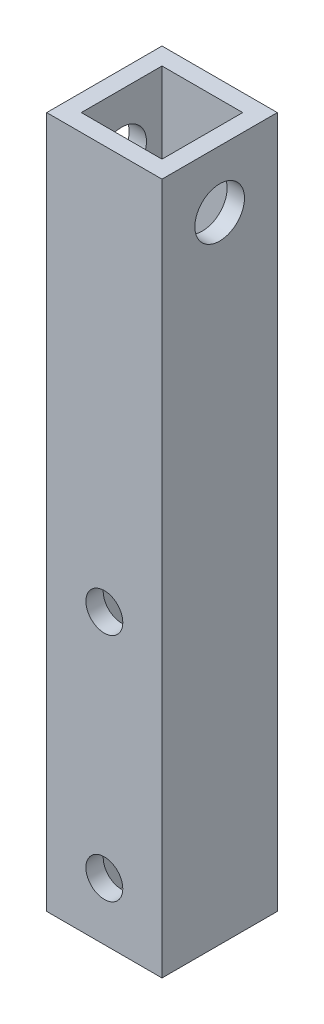
ISO-10303-21;
HEADER;
FILE_DESCRIPTION(('STEP AP214'),'2;1');
FILE_NAME('part.step','',(''),(''),'','','');
FILE_SCHEMA(('AUTOMOTIVE_DESIGN { 1 0 10303 214 1 1 1 1 }'));
ENDSEC;
DATA;
#1=APPLICATION_CONTEXT('core data for automotive mechanical design processes');
#2=APPLICATION_PROTOCOL_DEFINITION('international standard','automotive_design',2000,#1);
#3=PRODUCT_CONTEXT('',#1,'mechanical');
#4=PRODUCT('Part','Part','',(#3));
#5=PRODUCT_RELATED_PRODUCT_CATEGORY('part','',(#4));
#6=PRODUCT_DEFINITION_FORMATION('','',#4);
#7=PRODUCT_DEFINITION_CONTEXT('part definition',#1,'design');
#8=PRODUCT_DEFINITION('design','',#6,#7);
#9=PRODUCT_DEFINITION_SHAPE('','',#8);
#10=(LENGTH_UNIT() NAMED_UNIT(*) SI_UNIT(.MILLI.,.METRE.));
#11=(NAMED_UNIT(*) PLANE_ANGLE_UNIT() SI_UNIT($,.RADIAN.));
#12=(NAMED_UNIT(*) SI_UNIT($,.STERADIAN.) SOLID_ANGLE_UNIT());
#13=UNCERTAINTY_MEASURE_WITH_UNIT(LENGTH_MEASURE(1.E-05),#10,'distance_accuracy_value','');
#14=(GEOMETRIC_REPRESENTATION_CONTEXT(3) GLOBAL_UNCERTAINTY_ASSIGNED_CONTEXT((#13)) GLOBAL_UNIT_ASSIGNED_CONTEXT((#10,
#11,#12)) REPRESENTATION_CONTEXT('',''));
#15=CARTESIAN_POINT('',(0.,0.,0.));
#16=DIRECTION('',(0.,0.,1.));
#17=DIRECTION('',(1.,0.,0.));
#18=AXIS2_PLACEMENT_3D('',#15,#16,#17);
#19=CARTESIAN_POINT('',(0.,60.,0.));
#20=DIRECTION('',(0.,1.,0.));
#21=DIRECTION('',(0.,0.,1.));
#22=AXIS2_PLACEMENT_3D('',#19,#20,#21);
#23=PLANE('',#22);
#24=DIRECTION('',(0.,0.,-1.));
#25=VECTOR('',#24,1.);
#26=CARTESIAN_POINT('',(5.,60.,-5.));
#27=LINE('',#26,#25);
#28=CARTESIAN_POINT('',(5.,60.,5.));
#29=VERTEX_POINT('',#28);
#30=CARTESIAN_POINT('',(5.,60.,-5.));
#31=VERTEX_POINT('',#30);
#32=EDGE_CURVE('E162',#29,#31,#27,.T.);
#33=ORIENTED_EDGE('',*,*,#32,.T.);
#34=DIRECTION('',(-1.,0.,0.));
#35=VECTOR('',#34,1.);
#36=CARTESIAN_POINT('',(-5.,60.,-5.));
#37=LINE('',#36,#35);
#38=CARTESIAN_POINT('',(-5.,60.,-5.));
#39=VERTEX_POINT('',#38);
#40=EDGE_CURVE('E165',#31,#39,#37,.T.);
#41=ORIENTED_EDGE('',*,*,#40,.T.);
#42=DIRECTION('',(0.,0.,1.));
#43=VECTOR('',#42,1.);
#44=CARTESIAN_POINT('',(-5.,60.,-5.));
#45=LINE('',#44,#43);
#46=CARTESIAN_POINT('',(-5.,60.,5.));
#47=VERTEX_POINT('',#46);
#48=EDGE_CURVE('E168',#39,#47,#45,.T.);
#49=ORIENTED_EDGE('',*,*,#48,.T.);
#50=DIRECTION('',(1.,0.,0.));
#51=VECTOR('',#50,1.);
#52=CARTESIAN_POINT('',(-5.,60.,5.));
#53=LINE('',#52,#51);
#54=EDGE_CURVE('E170',#47,#29,#53,.T.);
#55=ORIENTED_EDGE('',*,*,#54,.T.);
#56=EDGE_LOOP('',(#33,#41,#49,#55));
#57=FACE_BOUND('',#56,.T.);
#58=DIRECTION('',(-1.,0.,0.));
#59=VECTOR('',#58,1.);
#60=CARTESIAN_POINT('',(-5.,60.,-3.5));
#61=LINE('',#60,#59);
#62=CARTESIAN_POINT('',(3.5,60.,-3.5));
#63=VERTEX_POINT('',#62);
#64=CARTESIAN_POINT('',(-3.5,60.,-3.5));
#65=VERTEX_POINT('',#64);
#66=EDGE_CURVE('E132',#63,#65,#61,.T.);
#67=ORIENTED_EDGE('',*,*,#66,.F.);
#68=DIRECTION('',(0.,0.,-1.));
#69=VECTOR('',#68,1.);
#70=CARTESIAN_POINT('',(3.5,60.,-5.));
#71=LINE('',#70,#69);
#72=CARTESIAN_POINT('',(3.5,60.,3.5));
#73=VERTEX_POINT('',#72);
#74=EDGE_CURVE('E124',#73,#63,#71,.T.);
#75=ORIENTED_EDGE('',*,*,#74,.F.);
#76=DIRECTION('',(1.,0.,0.));
#77=VECTOR('',#76,1.);
#78=CARTESIAN_POINT('',(-5.,60.,3.5));
#79=LINE('',#78,#77);
#80=CARTESIAN_POINT('',(-3.5,60.,3.5));
#81=VERTEX_POINT('',#80);
#82=EDGE_CURVE('E146',#81,#73,#79,.T.);
#83=ORIENTED_EDGE('',*,*,#82,.F.);
#84=DIRECTION('',(0.,0.,1.));
#85=VECTOR('',#84,1.);
#86=CARTESIAN_POINT('',(-3.5,60.,-5.));
#87=LINE('',#86,#85);
#88=EDGE_CURVE('E144',#65,#81,#87,.T.);
#89=ORIENTED_EDGE('',*,*,#88,.F.);
#90=EDGE_LOOP('',(#67,#75,#83,#89));
#91=FACE_BOUND('',#90,.T.);
#92=ADVANCED_FACE('F57',(#57,#91),#23,.T.);
#93=CARTESIAN_POINT('',(0.,0.,0.));
#94=DIRECTION('',(0.,1.,0.));
#95=DIRECTION('',(0.,0.,1.));
#96=AXIS2_PLACEMENT_3D('',#93,#94,#95);
#97=PLANE('',#96);
#98=DIRECTION('',(0.,0.,-1.));
#99=VECTOR('',#98,1.);
#100=CARTESIAN_POINT('',(5.,0.,-5.));
#101=LINE('',#100,#99);
#102=CARTESIAN_POINT('',(5.,0.,5.));
#103=VERTEX_POINT('',#102);
#104=CARTESIAN_POINT('',(5.,0.,-5.));
#105=VERTEX_POINT('',#104);
#106=EDGE_CURVE('E140',#103,#105,#101,.T.);
#107=ORIENTED_EDGE('',*,*,#106,.F.);
#108=DIRECTION('',(1.,0.,0.));
#109=VECTOR('',#108,1.);
#110=CARTESIAN_POINT('',(-5.,0.,5.));
#111=LINE('',#110,#109);
#112=CARTESIAN_POINT('',(-5.,0.,5.));
#113=VERTEX_POINT('',#112);
#114=EDGE_CURVE('E166',#113,#103,#111,.T.);
#115=ORIENTED_EDGE('',*,*,#114,.F.);
#116=DIRECTION('',(0.,0.,1.));
#117=VECTOR('',#116,1.);
#118=CARTESIAN_POINT('',(-5.,0.,-5.));
#119=LINE('',#118,#117);
#120=CARTESIAN_POINT('',(-5.,0.,-5.));
#121=VERTEX_POINT('',#120);
#122=EDGE_CURVE('E177',#121,#113,#119,.T.);
#123=ORIENTED_EDGE('',*,*,#122,.F.);
#124=DIRECTION('',(-1.,0.,0.));
#125=VECTOR('',#124,1.);
#126=CARTESIAN_POINT('',(-5.,0.,-5.));
#127=LINE('',#126,#125);
#128=EDGE_CURVE('E175',#105,#121,#127,.T.);
#129=ORIENTED_EDGE('',*,*,#128,.F.);
#130=EDGE_LOOP('',(#107,#115,#123,#129));
#131=FACE_BOUND('',#130,.T.);
#132=DIRECTION('',(0.,0.,-1.));
#133=VECTOR('',#132,1.);
#134=CARTESIAN_POINT('',(3.5,0.,-5.));
#135=LINE('',#134,#133);
#136=CARTESIAN_POINT('',(3.5,0.,3.5));
#137=VERTEX_POINT('',#136);
#138=CARTESIAN_POINT('',(3.5,0.,-3.5));
#139=VERTEX_POINT('',#138);
#140=EDGE_CURVE('E82',#137,#139,#135,.T.);
#141=ORIENTED_EDGE('',*,*,#140,.T.);
#142=DIRECTION('',(-1.,0.,0.));
#143=VECTOR('',#142,1.);
#144=CARTESIAN_POINT('',(-5.,0.,-3.5));
#145=LINE('',#144,#143);
#146=CARTESIAN_POINT('',(-3.5,0.,-3.5));
#147=VERTEX_POINT('',#146);
#148=EDGE_CURVE('E139',#139,#147,#145,.T.);
#149=ORIENTED_EDGE('',*,*,#148,.T.);
#150=DIRECTION('',(0.,0.,1.));
#151=VECTOR('',#150,1.);
#152=CARTESIAN_POINT('',(-3.5,0.,-5.));
#153=LINE('',#152,#151);
#154=CARTESIAN_POINT('',(-3.5,0.,3.5));
#155=VERTEX_POINT('',#154);
#156=EDGE_CURVE('E154',#147,#155,#153,.T.);
#157=ORIENTED_EDGE('',*,*,#156,.T.);
#158=DIRECTION('',(1.,0.,0.));
#159=VECTOR('',#158,1.);
#160=CARTESIAN_POINT('',(-5.,0.,3.5));
#161=LINE('',#160,#159);
#162=EDGE_CURVE('E133',#155,#137,#161,.T.);
#163=ORIENTED_EDGE('',*,*,#162,.T.);
#164=EDGE_LOOP('',(#141,#149,#157,#163));
#165=FACE_BOUND('',#164,.T.);
#166=ADVANCED_FACE('F235',(#131,#165),#97,.F.);
#167=CARTESIAN_POINT('',(5.,60.,-5.));
#168=DIRECTION('',(-1.,0.,0.));
#169=DIRECTION('',(0.,0.,1.));
#170=AXIS2_PLACEMENT_3D('',#167,#168,#169);
#171=PLANE('',#170);
#172=CARTESIAN_POINT('',(5.,55.,0.));
#173=DIRECTION('',(1.,0.,0.));
#174=DIRECTION('',(0.,0.,-1.));
#175=AXIS2_PLACEMENT_3D('',#172,#173,#174);
#176=CIRCLE('',#175,2.15);
#177=CARTESIAN_POINT('',(5.,55.,-2.15));
#178=VERTEX_POINT('',#177);
#179=EDGE_CURVE('E215',#178,#178,#176,.T.);
#180=ORIENTED_EDGE('',*,*,#179,.F.);
#181=EDGE_LOOP('',(#180));
#182=FACE_BOUND('',#181,.T.);
#183=ORIENTED_EDGE('',*,*,#106,.T.);
#184=DIRECTION('',(0.,-1.,0.));
#185=VECTOR('',#184,1.);
#186=CARTESIAN_POINT('',(5.,60.,-5.));
#187=LINE('',#186,#185);
#188=EDGE_CURVE('E12',#31,#105,#187,.T.);
#189=ORIENTED_EDGE('',*,*,#188,.F.);
#190=ORIENTED_EDGE('',*,*,#32,.F.);
#191=DIRECTION('',(0.,-1.,0.));
#192=VECTOR('',#191,1.);
#193=CARTESIAN_POINT('',(5.,60.,5.));
#194=LINE('',#193,#192);
#195=EDGE_CURVE('E172',#29,#103,#194,.T.);
#196=ORIENTED_EDGE('',*,*,#195,.T.);
#197=EDGE_LOOP('',(#183,#189,#190,#196));
#198=FACE_BOUND('',#197,.T.);
#199=ADVANCED_FACE('F59',(#182,#198),#171,.F.);
#200=CARTESIAN_POINT('',(-5.,60.,-5.));
#201=DIRECTION('',(0.,0.,1.));
#202=DIRECTION('',(1.,0.,0.));
#203=AXIS2_PLACEMENT_3D('',#200,#201,#202);
#204=PLANE('',#203);
#205=CARTESIAN_POINT('',(0.,25.,-5.));
#206=DIRECTION('',(0.,0.,1.));
#207=DIRECTION('',(1.,0.,0.));
#208=AXIS2_PLACEMENT_3D('',#205,#206,#207);
#209=CIRCLE('',#208,1.6);
#210=CARTESIAN_POINT('',(1.6,25.,-5.));
#211=VERTEX_POINT('',#210);
#212=EDGE_CURVE('E190',#211,#211,#209,.T.);
#213=ORIENTED_EDGE('',*,*,#212,.T.);
#214=EDGE_LOOP('',(#213));
#215=FACE_BOUND('',#214,.T.);
#216=CARTESIAN_POINT('',(0.,5.,-5.));
#217=DIRECTION('',(0.,0.,1.));
#218=DIRECTION('',(1.,0.,0.));
#219=AXIS2_PLACEMENT_3D('',#216,#217,#218);
#220=CIRCLE('',#219,1.6);
#221=CARTESIAN_POINT('',(1.6,5.,-5.));
#222=VERTEX_POINT('',#221);
#223=EDGE_CURVE('E204',#222,#222,#220,.T.);
#224=ORIENTED_EDGE('',*,*,#223,.T.);
#225=EDGE_LOOP('',(#224));
#226=FACE_BOUND('',#225,.T.);
#227=ORIENTED_EDGE('',*,*,#128,.T.);
#228=DIRECTION('',(0.,-1.,0.));
#229=VECTOR('',#228,1.);
#230=CARTESIAN_POINT('',(-5.,60.,-5.));
#231=LINE('',#230,#229);
#232=EDGE_CURVE('E66',#39,#121,#231,.T.);
#233=ORIENTED_EDGE('',*,*,#232,.F.);
#234=ORIENTED_EDGE('',*,*,#40,.F.);
#235=ORIENTED_EDGE('',*,*,#188,.T.);
#236=EDGE_LOOP('',(#227,#233,#234,#235));
#237=FACE_BOUND('',#236,.T.);
#238=ADVANCED_FACE('F265',(#215,#226,#237),#204,.F.);
#239=CARTESIAN_POINT('',(-5.,60.,-5.));
#240=DIRECTION('',(1.,0.,0.));
#241=DIRECTION('',(0.,0.,-1.));
#242=AXIS2_PLACEMENT_3D('',#239,#240,#241);
#243=PLANE('',#242);
#244=CARTESIAN_POINT('',(-5.,55.,0.));
#245=DIRECTION('',(1.,0.,0.));
#246=DIRECTION('',(0.,0.,-1.));
#247=AXIS2_PLACEMENT_3D('',#244,#245,#246);
#248=CIRCLE('',#247,2.15);
#249=CARTESIAN_POINT('',(-5.,55.,-2.15));
#250=VERTEX_POINT('',#249);
#251=EDGE_CURVE('E218',#250,#250,#248,.T.);
#252=ORIENTED_EDGE('',*,*,#251,.T.);
#253=EDGE_LOOP('',(#252));
#254=FACE_BOUND('',#253,.T.);
#255=ORIENTED_EDGE('',*,*,#122,.T.);
#256=DIRECTION('',(0.,-1.,0.));
#257=VECTOR('',#256,1.);
#258=CARTESIAN_POINT('',(-5.,60.,5.));
#259=LINE('',#258,#257);
#260=EDGE_CURVE('E182',#47,#113,#259,.T.);
#261=ORIENTED_EDGE('',*,*,#260,.F.);
#262=ORIENTED_EDGE('',*,*,#48,.F.);
#263=ORIENTED_EDGE('',*,*,#232,.T.);
#264=EDGE_LOOP('',(#255,#261,#262,#263));
#265=FACE_BOUND('',#264,.T.);
#266=ADVANCED_FACE('F262',(#254,#265),#243,.F.);
#267=CARTESIAN_POINT('',(-5.,60.,5.));
#268=DIRECTION('',(0.,0.,-1.));
#269=DIRECTION('',(-1.,0.,0.));
#270=AXIS2_PLACEMENT_3D('',#267,#268,#269);
#271=PLANE('',#270);
#272=CARTESIAN_POINT('',(0.,25.,5.));
#273=DIRECTION('',(0.,0.,1.));
#274=DIRECTION('',(1.,0.,0.));
#275=AXIS2_PLACEMENT_3D('',#272,#273,#274);
#276=CIRCLE('',#275,1.6);
#277=CARTESIAN_POINT('',(1.6,25.,5.));
#278=VERTEX_POINT('',#277);
#279=EDGE_CURVE('E208',#278,#278,#276,.T.);
#280=ORIENTED_EDGE('',*,*,#279,.F.);
#281=EDGE_LOOP('',(#280));
#282=FACE_BOUND('',#281,.T.);
#283=CARTESIAN_POINT('',(0.,5.,5.));
#284=DIRECTION('',(0.,0.,1.));
#285=DIRECTION('',(1.,0.,0.));
#286=AXIS2_PLACEMENT_3D('',#283,#284,#285);
#287=CIRCLE('',#286,1.6);
#288=CARTESIAN_POINT('',(1.6,5.,5.));
#289=VERTEX_POINT('',#288);
#290=EDGE_CURVE('E201',#289,#289,#287,.T.);
#291=ORIENTED_EDGE('',*,*,#290,.F.);
#292=EDGE_LOOP('',(#291));
#293=FACE_BOUND('',#292,.T.);
#294=ORIENTED_EDGE('',*,*,#114,.T.);
#295=ORIENTED_EDGE('',*,*,#195,.F.);
#296=ORIENTED_EDGE('',*,*,#54,.F.);
#297=ORIENTED_EDGE('',*,*,#260,.T.);
#298=EDGE_LOOP('',(#294,#295,#296,#297));
#299=FACE_BOUND('',#298,.T.);
#300=ADVANCED_FACE('F259',(#282,#293,#299),#271,.F.);
#301=CARTESIAN_POINT('',(3.5,60.,-5.));
#302=DIRECTION('',(-1.,0.,0.));
#303=DIRECTION('',(0.,0.,1.));
#304=AXIS2_PLACEMENT_3D('',#301,#302,#303);
#305=PLANE('',#304);
#306=CARTESIAN_POINT('',(3.5,55.,0.));
#307=DIRECTION('',(-1.,0.,0.));
#308=DIRECTION('',(0.,0.,1.));
#309=AXIS2_PLACEMENT_3D('',#306,#307,#308);
#310=CIRCLE('',#309,2.15);
#311=CARTESIAN_POINT('',(3.5,55.,2.15));
#312=VERTEX_POINT('',#311);
#313=EDGE_CURVE('E205',#312,#312,#310,.T.);
#314=ORIENTED_EDGE('',*,*,#313,.F.);
#315=EDGE_LOOP('',(#314));
#316=FACE_BOUND('',#315,.T.);
#317=ORIENTED_EDGE('',*,*,#140,.F.);
#318=DIRECTION('',(0.,-1.,0.));
#319=VECTOR('',#318,1.);
#320=CARTESIAN_POINT('',(3.5,60.,3.5));
#321=LINE('',#320,#319);
#322=EDGE_CURVE('E128',#73,#137,#321,.T.);
#323=ORIENTED_EDGE('',*,*,#322,.F.);
#324=ORIENTED_EDGE('',*,*,#74,.T.);
#325=DIRECTION('',(0.,-1.,0.));
#326=VECTOR('',#325,1.);
#327=CARTESIAN_POINT('',(3.5,60.,-3.5));
#328=LINE('',#327,#326);
#329=EDGE_CURVE('E127',#63,#139,#328,.T.);
#330=ORIENTED_EDGE('',*,*,#329,.T.);
#331=EDGE_LOOP('',(#317,#323,#324,#330));
#332=FACE_BOUND('',#331,.T.);
#333=ADVANCED_FACE('F126',(#316,#332),#305,.T.);
#334=CARTESIAN_POINT('',(-5.,60.,-3.5));
#335=DIRECTION('',(0.,0.,1.));
#336=DIRECTION('',(1.,0.,0.));
#337=AXIS2_PLACEMENT_3D('',#334,#335,#336);
#338=PLANE('',#337);
#339=CARTESIAN_POINT('',(0.,25.,-3.5));
#340=DIRECTION('',(0.,0.,1.));
#341=DIRECTION('',(1.,0.,0.));
#342=AXIS2_PLACEMENT_3D('',#339,#340,#341);
#343=CIRCLE('',#342,1.6);
#344=CARTESIAN_POINT('',(1.6,25.,-3.5));
#345=VERTEX_POINT('',#344);
#346=EDGE_CURVE('E152',#345,#345,#343,.T.);
#347=ORIENTED_EDGE('',*,*,#346,.F.);
#348=EDGE_LOOP('',(#347));
#349=FACE_BOUND('',#348,.T.);
#350=CARTESIAN_POINT('',(0.,5.,-3.5));
#351=DIRECTION('',(0.,0.,1.));
#352=DIRECTION('',(1.,0.,0.));
#353=AXIS2_PLACEMENT_3D('',#350,#351,#352);
#354=CIRCLE('',#353,1.6);
#355=CARTESIAN_POINT('',(1.6,5.,-3.5));
#356=VERTEX_POINT('',#355);
#357=EDGE_CURVE('E189',#356,#356,#354,.T.);
#358=ORIENTED_EDGE('',*,*,#357,.F.);
#359=EDGE_LOOP('',(#358));
#360=FACE_BOUND('',#359,.T.);
#361=ORIENTED_EDGE('',*,*,#148,.F.);
#362=ORIENTED_EDGE('',*,*,#329,.F.);
#363=ORIENTED_EDGE('',*,*,#66,.T.);
#364=DIRECTION('',(0.,-1.,0.));
#365=VECTOR('',#364,1.);
#366=CARTESIAN_POINT('',(-3.5,60.,-3.5));
#367=LINE('',#366,#365);
#368=EDGE_CURVE('E141',#65,#147,#367,.T.);
#369=ORIENTED_EDGE('',*,*,#368,.T.);
#370=EDGE_LOOP('',(#361,#362,#363,#369));
#371=FACE_BOUND('',#370,.T.);
#372=ADVANCED_FACE('F136',(#349,#360,#371),#338,.T.);
#373=CARTESIAN_POINT('',(-3.5,60.,-5.));
#374=DIRECTION('',(1.,0.,0.));
#375=DIRECTION('',(0.,0.,-1.));
#376=AXIS2_PLACEMENT_3D('',#373,#374,#375);
#377=PLANE('',#376);
#378=CARTESIAN_POINT('',(-3.5,55.,0.));
#379=DIRECTION('',(1.,0.,0.));
#380=DIRECTION('',(0.,0.,-1.));
#381=AXIS2_PLACEMENT_3D('',#378,#379,#380);
#382=CIRCLE('',#381,2.15);
#383=CARTESIAN_POINT('',(-3.5,55.,-2.15));
#384=VERTEX_POINT('',#383);
#385=EDGE_CURVE('E61',#384,#384,#382,.T.);
#386=ORIENTED_EDGE('',*,*,#385,.F.);
#387=EDGE_LOOP('',(#386));
#388=FACE_BOUND('',#387,.T.);
#389=ORIENTED_EDGE('',*,*,#156,.F.);
#390=ORIENTED_EDGE('',*,*,#368,.F.);
#391=ORIENTED_EDGE('',*,*,#88,.T.);
#392=DIRECTION('',(0.,-1.,0.));
#393=VECTOR('',#392,1.);
#394=CARTESIAN_POINT('',(-3.5,60.,3.5));
#395=LINE('',#394,#393);
#396=EDGE_CURVE('E74',#81,#155,#395,.T.);
#397=ORIENTED_EDGE('',*,*,#396,.T.);
#398=EDGE_LOOP('',(#389,#390,#391,#397));
#399=FACE_BOUND('',#398,.T.);
#400=ADVANCED_FACE('F228',(#388,#399),#377,.T.);
#401=CARTESIAN_POINT('',(-5.,60.,3.5));
#402=DIRECTION('',(0.,0.,-1.));
#403=DIRECTION('',(-1.,0.,0.));
#404=AXIS2_PLACEMENT_3D('',#401,#402,#403);
#405=PLANE('',#404);
#406=CARTESIAN_POINT('',(0.,25.,3.5));
#407=DIRECTION('',(0.,0.,-1.));
#408=DIRECTION('',(-1.,0.,0.));
#409=AXIS2_PLACEMENT_3D('',#406,#407,#408);
#410=CIRCLE('',#409,1.6);
#411=CARTESIAN_POINT('',(-1.6,25.,3.5));
#412=VERTEX_POINT('',#411);
#413=EDGE_CURVE('E191',#412,#412,#410,.T.);
#414=ORIENTED_EDGE('',*,*,#413,.F.);
#415=EDGE_LOOP('',(#414));
#416=FACE_BOUND('',#415,.T.);
#417=CARTESIAN_POINT('',(0.,5.,3.5));
#418=DIRECTION('',(0.,0.,-1.));
#419=DIRECTION('',(-1.,0.,0.));
#420=AXIS2_PLACEMENT_3D('',#417,#418,#419);
#421=CIRCLE('',#420,1.6);
#422=CARTESIAN_POINT('',(-1.6,5.,3.5));
#423=VERTEX_POINT('',#422);
#424=EDGE_CURVE('E187',#423,#423,#421,.T.);
#425=ORIENTED_EDGE('',*,*,#424,.F.);
#426=EDGE_LOOP('',(#425));
#427=FACE_BOUND('',#426,.T.);
#428=ORIENTED_EDGE('',*,*,#162,.F.);
#429=ORIENTED_EDGE('',*,*,#396,.F.);
#430=ORIENTED_EDGE('',*,*,#82,.T.);
#431=ORIENTED_EDGE('',*,*,#322,.T.);
#432=EDGE_LOOP('',(#428,#429,#430,#431));
#433=FACE_BOUND('',#432,.T.);
#434=ADVANCED_FACE('F231',(#416,#427,#433),#405,.T.);
#435=CARTESIAN_POINT('',(0.,5.,-5.));
#436=DIRECTION('',(0.,0.,1.));
#437=DIRECTION('',(1.,0.,0.));
#438=AXIS2_PLACEMENT_3D('',#435,#436,#437);
#439=CYLINDRICAL_SURFACE('',#438,1.6);
#440=ORIENTED_EDGE('',*,*,#424,.T.);
#441=EDGE_LOOP('',(#440));
#442=FACE_BOUND('',#441,.T.);
#443=ORIENTED_EDGE('',*,*,#290,.T.);
#444=EDGE_LOOP('',(#443));
#445=FACE_BOUND('',#444,.T.);
#446=ADVANCED_FACE('F237',(#442,#445),#439,.F.);
#447=CARTESIAN_POINT('',(0.,25.,-5.));
#448=DIRECTION('',(0.,0.,1.));
#449=DIRECTION('',(1.,0.,0.));
#450=AXIS2_PLACEMENT_3D('',#447,#448,#449);
#451=CYLINDRICAL_SURFACE('',#450,1.6);
#452=ORIENTED_EDGE('',*,*,#413,.T.);
#453=EDGE_LOOP('',(#452));
#454=FACE_BOUND('',#453,.T.);
#455=ORIENTED_EDGE('',*,*,#279,.T.);
#456=EDGE_LOOP('',(#455));
#457=FACE_BOUND('',#456,.T.);
#458=ADVANCED_FACE('F243',(#454,#457),#451,.F.);
#459=ORIENTED_EDGE('',*,*,#357,.T.);
#460=EDGE_LOOP('',(#459));
#461=FACE_BOUND('',#460,.T.);
#462=ORIENTED_EDGE('',*,*,#223,.F.);
#463=EDGE_LOOP('',(#462));
#464=FACE_BOUND('',#463,.T.);
#465=ADVANCED_FACE('F246',(#461,#464),#439,.F.);
#466=ORIENTED_EDGE('',*,*,#346,.T.);
#467=EDGE_LOOP('',(#466));
#468=FACE_BOUND('',#467,.T.);
#469=ORIENTED_EDGE('',*,*,#212,.F.);
#470=EDGE_LOOP('',(#469));
#471=FACE_BOUND('',#470,.T.);
#472=ADVANCED_FACE('F291',(#468,#471),#451,.F.);
#473=CARTESIAN_POINT('',(-5.,55.,0.));
#474=DIRECTION('',(1.,0.,0.));
#475=DIRECTION('',(0.,0.,-1.));
#476=AXIS2_PLACEMENT_3D('',#473,#474,#475);
#477=CYLINDRICAL_SURFACE('',#476,2.15);
#478=ORIENTED_EDGE('',*,*,#385,.T.);
#479=EDGE_LOOP('',(#478));
#480=FACE_BOUND('',#479,.T.);
#481=ORIENTED_EDGE('',*,*,#251,.F.);
#482=EDGE_LOOP('',(#481));
#483=FACE_BOUND('',#482,.T.);
#484=ADVANCED_FACE('F225',(#480,#483),#477,.F.);
#485=ORIENTED_EDGE('',*,*,#313,.T.);
#486=EDGE_LOOP('',(#485));
#487=FACE_BOUND('',#486,.T.);
#488=ORIENTED_EDGE('',*,*,#179,.T.);
#489=EDGE_LOOP('',(#488));
#490=FACE_BOUND('',#489,.T.);
#491=ADVANCED_FACE('F300',(#487,#490),#477,.F.);
#492=CLOSED_SHELL('',(#92,#166,#199,#238,#266,#300,#333,#372,#400,#434,#446,#458,#465,#472,#484,#491));
#493=MANIFOLD_SOLID_BREP('B2',#492);
#494=ADVANCED_BREP_SHAPE_REPRESENTATION('',(#18,#493),#14);
#495=SHAPE_DEFINITION_REPRESENTATION(#9,#494);
ENDSEC;
END-ISO-10303-21;
